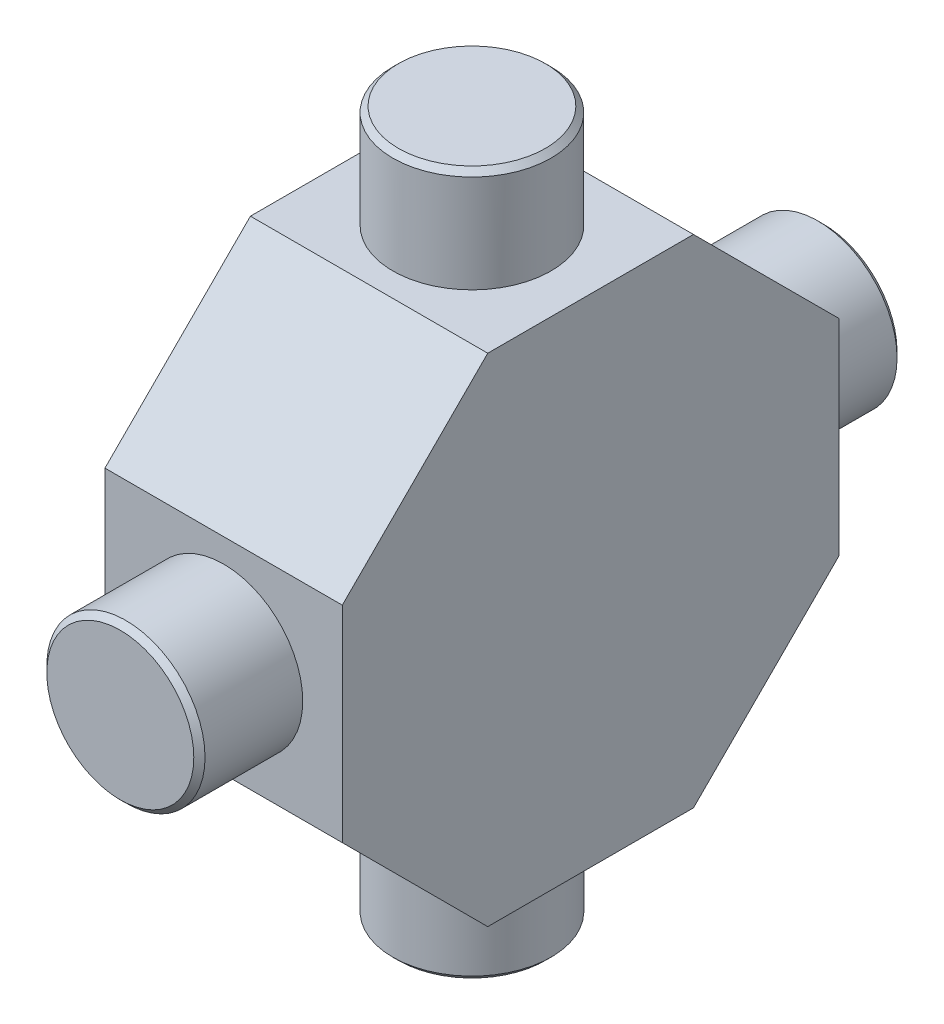
ISO-10303-21;
HEADER;
FILE_DESCRIPTION(('STEP AP214'),'2;1');
FILE_NAME('part.step','',(''),(''),'','','');
FILE_SCHEMA(('AUTOMOTIVE_DESIGN { 1 0 10303 214 1 1 1 1 }'));
ENDSEC;
DATA;
#1=APPLICATION_CONTEXT('core data for automotive mechanical design processes');
#2=APPLICATION_PROTOCOL_DEFINITION('international standard','automotive_design',2000,#1);
#3=PRODUCT_CONTEXT('',#1,'mechanical');
#4=PRODUCT('Part','Part','',(#3));
#5=PRODUCT_RELATED_PRODUCT_CATEGORY('part','',(#4));
#6=PRODUCT_DEFINITION_FORMATION('','',#4);
#7=PRODUCT_DEFINITION_CONTEXT('part definition',#1,'design');
#8=PRODUCT_DEFINITION('design','',#6,#7);
#9=PRODUCT_DEFINITION_SHAPE('','',#8);
#10=(LENGTH_UNIT() NAMED_UNIT(*) SI_UNIT(.MILLI.,.METRE.));
#11=(NAMED_UNIT(*) PLANE_ANGLE_UNIT() SI_UNIT($,.RADIAN.));
#12=(NAMED_UNIT(*) SI_UNIT($,.STERADIAN.) SOLID_ANGLE_UNIT());
#13=UNCERTAINTY_MEASURE_WITH_UNIT(LENGTH_MEASURE(1.E-05),#10,'distance_accuracy_value','');
#14=(GEOMETRIC_REPRESENTATION_CONTEXT(3) GLOBAL_UNCERTAINTY_ASSIGNED_CONTEXT((#13)) GLOBAL_UNIT_ASSIGNED_CONTEXT((#10,
#11,#12)) REPRESENTATION_CONTEXT('',''));
#15=CARTESIAN_POINT('',(0.,0.,0.));
#16=DIRECTION('',(0.,0.,1.));
#17=DIRECTION('',(1.,0.,0.));
#18=AXIS2_PLACEMENT_3D('',#15,#16,#17);
#19=CARTESIAN_POINT('',(10.715625,-22.4204995770636,9.286875));
#20=DIRECTION('',(0.,1.,0.));
#21=DIRECTION('',(0.,0.,1.));
#22=AXIS2_PLACEMENT_3D('',#19,#20,#21);
#23=PLANE('',#22);
#24=DIRECTION('',(0.,0.,-1.));
#25=VECTOR('',#24,1.);
#26=CARTESIAN_POINT('',(-10.715625,-22.4204995770636,9.286875));
#27=LINE('',#26,#25);
#28=CARTESIAN_POINT('',(-10.715625,-22.4204995770636,9.286875));
#29=VERTEX_POINT('',#28);
#30=CARTESIAN_POINT('',(-10.715625,-22.4204995770636,-9.28687499999999));
#31=VERTEX_POINT('',#30);
#32=EDGE_CURVE('E142',#29,#31,#27,.T.);
#33=ORIENTED_EDGE('',*,*,#32,.T.);
#34=DIRECTION('',(-1.,0.,0.));
#35=VECTOR('',#34,1.);
#36=CARTESIAN_POINT('',(10.715625,-22.4204995770636,-9.28687499999999));
#37=LINE('',#36,#35);
#38=CARTESIAN_POINT('',(10.715625,-22.4204995770636,-9.28687499999999));
#39=VERTEX_POINT('',#38);
#40=EDGE_CURVE('E183',#39,#31,#37,.T.);
#41=ORIENTED_EDGE('',*,*,#40,.F.);
#42=DIRECTION('',(0.,0.,-1.));
#43=VECTOR('',#42,1.);
#44=CARTESIAN_POINT('',(10.715625,-22.4204995770636,9.286875));
#45=LINE('',#44,#43);
#46=CARTESIAN_POINT('',(10.715625,-22.4204995770636,9.286875));
#47=VERTEX_POINT('',#46);
#48=EDGE_CURVE('E164',#47,#39,#45,.T.);
#49=ORIENTED_EDGE('',*,*,#48,.F.);
#50=DIRECTION('',(-1.,0.,0.));
#51=VECTOR('',#50,1.);
#52=CARTESIAN_POINT('',(10.715625,-22.4204995770636,9.286875));
#53=LINE('',#52,#51);
#54=EDGE_CURVE('E138',#47,#29,#53,.T.);
#55=ORIENTED_EDGE('',*,*,#54,.T.);
#56=EDGE_LOOP('',(#33,#41,#49,#55));
#57=FACE_BOUND('',#56,.T.);
#58=CARTESIAN_POINT('',(0.,-22.4204995770636,0.));
#59=DIRECTION('',(0.,1.,0.));
#60=DIRECTION('',(0.,0.,1.));
#61=AXIS2_PLACEMENT_3D('',#58,#59,#60);
#62=CIRCLE('',#61,7.14375);
#63=CARTESIAN_POINT('',(0.,-22.4204995770636,7.14375));
#64=VERTEX_POINT('',#63);
#65=EDGE_CURVE('E198',#64,#64,#62,.F.);
#66=ORIENTED_EDGE('',*,*,#65,.F.);
#67=EDGE_LOOP('',(#66));
#68=FACE_BOUND('',#67,.T.);
#69=ADVANCED_FACE('F39',(#57,#68),#23,.F.);
#70=CARTESIAN_POINT('',(10.715625,22.4204995770636,-9.28687500000001));
#71=DIRECTION('',(0.,-1.,0.));
#72=DIRECTION('',(0.,0.,-1.));
#73=AXIS2_PLACEMENT_3D('',#70,#71,#72);
#74=PLANE('',#73);
#75=DIRECTION('',(0.,0.,1.));
#76=VECTOR('',#75,1.);
#77=CARTESIAN_POINT('',(-10.715625,22.4204995770636,-9.28687500000001));
#78=LINE('',#77,#76);
#79=CARTESIAN_POINT('',(-10.715625,22.4204995770636,-9.28687500000001));
#80=VERTEX_POINT('',#79);
#81=CARTESIAN_POINT('',(-10.715625,22.4204995770636,9.28687499999998));
#82=VERTEX_POINT('',#81);
#83=EDGE_CURVE('E155',#80,#82,#78,.T.);
#84=ORIENTED_EDGE('',*,*,#83,.T.);
#85=DIRECTION('',(-1.,0.,0.));
#86=VECTOR('',#85,1.);
#87=CARTESIAN_POINT('',(10.715625,22.4204995770636,9.28687499999998));
#88=LINE('',#87,#86);
#89=CARTESIAN_POINT('',(10.715625,22.4204995770636,9.28687499999998));
#90=VERTEX_POINT('',#89);
#91=EDGE_CURVE('E131',#90,#82,#88,.T.);
#92=ORIENTED_EDGE('',*,*,#91,.F.);
#93=DIRECTION('',(0.,0.,1.));
#94=VECTOR('',#93,1.);
#95=CARTESIAN_POINT('',(10.715625,22.4204995770636,-9.28687500000001));
#96=LINE('',#95,#94);
#97=CARTESIAN_POINT('',(10.715625,22.4204995770636,-9.28687500000001));
#98=VERTEX_POINT('',#97);
#99=EDGE_CURVE('E120',#98,#90,#96,.T.);
#100=ORIENTED_EDGE('',*,*,#99,.F.);
#101=DIRECTION('',(-1.,0.,0.));
#102=VECTOR('',#101,1.);
#103=CARTESIAN_POINT('',(10.715625,22.4204995770636,-9.28687500000001));
#104=LINE('',#103,#102);
#105=EDGE_CURVE('E171',#98,#80,#104,.T.);
#106=ORIENTED_EDGE('',*,*,#105,.T.);
#107=EDGE_LOOP('',(#84,#92,#100,#106));
#108=FACE_BOUND('',#107,.T.);
#109=CARTESIAN_POINT('',(0.,22.4204995770636,0.));
#110=DIRECTION('',(0.,-1.,0.));
#111=DIRECTION('',(0.,0.,-1.));
#112=AXIS2_PLACEMENT_3D('',#109,#110,#111);
#113=CIRCLE('',#112,7.14375);
#114=CARTESIAN_POINT('',(0.,22.4204995770636,-7.14375));
#115=VERTEX_POINT('',#114);
#116=EDGE_CURVE('E194',#115,#115,#113,.F.);
#117=ORIENTED_EDGE('',*,*,#116,.F.);
#118=EDGE_LOOP('',(#117));
#119=FACE_BOUND('',#118,.T.);
#120=ADVANCED_FACE('F239',(#108,#119),#74,.F.);
#121=CARTESIAN_POINT('',(0.,0.,-31.75));
#122=DIRECTION('',(0.,0.,1.));
#123=DIRECTION('',(1.,0.,0.));
#124=AXIS2_PLACEMENT_3D('',#121,#122,#123);
#125=CYLINDRICAL_SURFACE('',#124,7.14375);
#126=CARTESIAN_POINT('',(0.,0.,-31.242));
#127=DIRECTION('',(0.,0.,1.));
#128=DIRECTION('',(1.,0.,0.));
#129=AXIS2_PLACEMENT_3D('',#126,#127,#128);
#130=CIRCLE('',#129,7.14375);
#131=CARTESIAN_POINT('',(7.14375,0.,-31.242));
#132=VERTEX_POINT('',#131);
#133=EDGE_CURVE('E199',#132,#132,#130,.T.);
#134=ORIENTED_EDGE('',*,*,#133,.T.);
#135=EDGE_LOOP('',(#134));
#136=FACE_BOUND('',#135,.T.);
#137=CARTESIAN_POINT('',(0.,0.,-22.4204995770636));
#138=DIRECTION('',(0.,0.,1.));
#139=DIRECTION('',(1.,0.,0.));
#140=AXIS2_PLACEMENT_3D('',#137,#138,#139);
#141=CIRCLE('',#140,7.14375);
#142=CARTESIAN_POINT('',(7.14375,0.,-22.4204995770636));
#143=VERTEX_POINT('',#142);
#144=EDGE_CURVE('E190',#143,#143,#141,.F.);
#145=ORIENTED_EDGE('',*,*,#144,.T.);
#146=EDGE_LOOP('',(#145));
#147=FACE_BOUND('',#146,.T.);
#148=ADVANCED_FACE('F245',(#136,#147),#125,.T.);
#149=CARTESIAN_POINT('',(0.,0.,-31.75));
#150=DIRECTION('',(0.,0.,1.));
#151=DIRECTION('',(1.,0.,0.));
#152=AXIS2_PLACEMENT_3D('',#149,#150,#151);
#153=PLANE('',#152);
#154=CARTESIAN_POINT('',(0.,0.,-31.75));
#155=DIRECTION('',(0.,0.,1.));
#156=DIRECTION('',(1.,0.,0.));
#157=AXIS2_PLACEMENT_3D('',#154,#155,#156);
#158=CIRCLE('',#157,6.63575);
#159=CARTESIAN_POINT('',(6.63575,0.,-31.75));
#160=VERTEX_POINT('',#159);
#161=EDGE_CURVE('E203',#160,#160,#158,.F.);
#162=ORIENTED_EDGE('',*,*,#161,.T.);
#163=EDGE_LOOP('',(#162));
#164=FACE_BOUND('',#163,.T.);
#165=ADVANCED_FACE('F259',(#164),#153,.F.);
#166=CARTESIAN_POINT('',(10.715625,-22.4204995770636,-9.28687499999999));
#167=DIRECTION('',(0.,0.707106781186548,0.707106781186547));
#168=DIRECTION('',(0.,-0.707106781186547,0.707106781186548));
#169=AXIS2_PLACEMENT_3D('',#166,#167,#168);
#170=PLANE('',#169);
#171=DIRECTION('',(0.,0.707106781186547,-0.707106781186548));
#172=VECTOR('',#171,1.);
#173=CARTESIAN_POINT('',(-10.715625,-22.4204995770636,-9.28687499999999));
#174=LINE('',#173,#172);
#175=CARTESIAN_POINT('',(-10.715625,-9.28687499999999,-22.4204995770636));
#176=VERTEX_POINT('',#175);
#177=EDGE_CURVE('E146',#31,#176,#174,.T.);
#178=ORIENTED_EDGE('',*,*,#177,.T.);
#179=DIRECTION('',(-1.,0.,0.));
#180=VECTOR('',#179,1.);
#181=CARTESIAN_POINT('',(10.715625,-9.28687499999999,-22.4204995770636));
#182=LINE('',#181,#180);
#183=CARTESIAN_POINT('',(10.715625,-9.28687499999999,-22.4204995770636));
#184=VERTEX_POINT('',#183);
#185=EDGE_CURVE('E179',#184,#176,#182,.T.);
#186=ORIENTED_EDGE('',*,*,#185,.F.);
#187=DIRECTION('',(0.,0.707106781186547,-0.707106781186548));
#188=VECTOR('',#187,1.);
#189=CARTESIAN_POINT('',(10.715625,-22.4204995770636,-9.28687499999999));
#190=LINE('',#189,#188);
#191=EDGE_CURVE('E101',#39,#184,#190,.T.);
#192=ORIENTED_EDGE('',*,*,#191,.F.);
#193=ORIENTED_EDGE('',*,*,#40,.T.);
#194=EDGE_LOOP('',(#178,#186,#192,#193));
#195=FACE_BOUND('',#194,.T.);
#196=ADVANCED_FACE('F251',(#195),#170,.F.);
#197=CARTESIAN_POINT('',(10.715625,-9.28687499999999,-22.4204995770636));
#198=DIRECTION('',(0.,0.,1.));
#199=DIRECTION('',(1.,0.,0.));
#200=AXIS2_PLACEMENT_3D('',#197,#198,#199);
#201=PLANE('',#200);
#202=ORIENTED_EDGE('',*,*,#144,.F.);
#203=EDGE_LOOP('',(#202));
#204=FACE_BOUND('',#203,.T.);
#205=DIRECTION('',(0.,1.,0.));
#206=VECTOR('',#205,1.);
#207=CARTESIAN_POINT('',(-10.715625,-9.28687499999999,-22.4204995770636));
#208=LINE('',#207,#206);
#209=CARTESIAN_POINT('',(-10.715625,9.286875,-22.4204995770636));
#210=VERTEX_POINT('',#209);
#211=EDGE_CURVE('E149',#176,#210,#208,.T.);
#212=ORIENTED_EDGE('',*,*,#211,.T.);
#213=DIRECTION('',(-1.,0.,0.));
#214=VECTOR('',#213,1.);
#215=CARTESIAN_POINT('',(10.715625,9.286875,-22.4204995770636));
#216=LINE('',#215,#214);
#217=CARTESIAN_POINT('',(10.715625,9.286875,-22.4204995770636));
#218=VERTEX_POINT('',#217);
#219=EDGE_CURVE('E175',#218,#210,#216,.T.);
#220=ORIENTED_EDGE('',*,*,#219,.F.);
#221=DIRECTION('',(0.,1.,0.));
#222=VECTOR('',#221,1.);
#223=CARTESIAN_POINT('',(10.715625,-9.28687499999999,-22.4204995770636));
#224=LINE('',#223,#222);
#225=EDGE_CURVE('E329',#184,#218,#224,.T.);
#226=ORIENTED_EDGE('',*,*,#225,.F.);
#227=ORIENTED_EDGE('',*,*,#185,.T.);
#228=EDGE_LOOP('',(#212,#220,#226,#227));
#229=FACE_BOUND('',#228,.T.);
#230=ADVANCED_FACE('F308',(#204,#229),#201,.F.);
#231=CARTESIAN_POINT('',(10.715625,9.286875,-22.4204995770636));
#232=DIRECTION('',(0.,-0.707106781186547,0.707106781186548));
#233=DIRECTION('',(0.,-0.707106781186548,-0.707106781186547));
#234=AXIS2_PLACEMENT_3D('',#231,#232,#233);
#235=PLANE('',#234);
#236=DIRECTION('',(0.,0.707106781186548,0.707106781186547));
#237=VECTOR('',#236,1.);
#238=CARTESIAN_POINT('',(-10.715625,9.286875,-22.4204995770636));
#239=LINE('',#238,#237);
#240=EDGE_CURVE('E152',#210,#80,#239,.T.);
#241=ORIENTED_EDGE('',*,*,#240,.T.);
#242=ORIENTED_EDGE('',*,*,#105,.F.);
#243=DIRECTION('',(0.,0.707106781186548,0.707106781186547));
#244=VECTOR('',#243,1.);
#245=CARTESIAN_POINT('',(10.715625,9.286875,-22.4204995770636));
#246=LINE('',#245,#244);
#247=EDGE_CURVE('E323',#218,#98,#246,.T.);
#248=ORIENTED_EDGE('',*,*,#247,.F.);
#249=ORIENTED_EDGE('',*,*,#219,.T.);
#250=EDGE_LOOP('',(#241,#242,#248,#249));
#251=FACE_BOUND('',#250,.T.);
#252=ADVANCED_FACE('F305',(#251),#235,.F.);
#253=CARTESIAN_POINT('',(10.715625,22.4204995770636,9.28687499999998));
#254=DIRECTION('',(0.,-0.707106781186548,-0.707106781186547));
#255=DIRECTION('',(0.,0.707106781186547,-0.707106781186548));
#256=AXIS2_PLACEMENT_3D('',#253,#254,#255);
#257=PLANE('',#256);
#258=DIRECTION('',(0.,-0.707106781186547,0.707106781186548));
#259=VECTOR('',#258,1.);
#260=CARTESIAN_POINT('',(-10.715625,22.4204995770636,9.28687499999998));
#261=LINE('',#260,#259);
#262=CARTESIAN_POINT('',(-10.715625,9.28687500000001,22.4204995770636));
#263=VERTEX_POINT('',#262);
#264=EDGE_CURVE('E129',#82,#263,#261,.T.);
#265=ORIENTED_EDGE('',*,*,#264,.T.);
#266=DIRECTION('',(-1.,0.,0.));
#267=VECTOR('',#266,1.);
#268=CARTESIAN_POINT('',(10.715625,9.28687500000001,22.4204995770636));
#269=LINE('',#268,#267);
#270=CARTESIAN_POINT('',(10.715625,9.28687500000001,22.4204995770636));
#271=VERTEX_POINT('',#270);
#272=EDGE_CURVE('E126',#271,#263,#269,.T.);
#273=ORIENTED_EDGE('',*,*,#272,.F.);
#274=DIRECTION('',(0.,-0.707106781186547,0.707106781186548));
#275=VECTOR('',#274,1.);
#276=CARTESIAN_POINT('',(10.715625,22.4204995770636,9.28687499999998));
#277=LINE('',#276,#275);
#278=EDGE_CURVE('E114',#90,#271,#277,.T.);
#279=ORIENTED_EDGE('',*,*,#278,.F.);
#280=ORIENTED_EDGE('',*,*,#91,.T.);
#281=EDGE_LOOP('',(#265,#273,#279,#280));
#282=FACE_BOUND('',#281,.T.);
#283=ADVANCED_FACE('F127',(#282),#257,.F.);
#284=CARTESIAN_POINT('',(10.715625,9.28687500000001,22.4204995770636));
#285=DIRECTION('',(0.,0.,-1.));
#286=DIRECTION('',(0.,1.,0.));
#287=AXIS2_PLACEMENT_3D('',#284,#285,#286);
#288=PLANE('',#287);
#289=CARTESIAN_POINT('',(0.,0.,22.4204995770636));
#290=DIRECTION('',(0.,0.,-1.));
#291=DIRECTION('',(0.,1.,0.));
#292=AXIS2_PLACEMENT_3D('',#289,#290,#291);
#293=CIRCLE('',#292,7.14375);
#294=CARTESIAN_POINT('',(0.,7.14375,22.4204995770636));
#295=VERTEX_POINT('',#294);
#296=EDGE_CURVE('E186',#295,#295,#293,.F.);
#297=ORIENTED_EDGE('',*,*,#296,.F.);
#298=EDGE_LOOP('',(#297));
#299=FACE_BOUND('',#298,.T.);
#300=DIRECTION('',(0.,-1.,0.));
#301=VECTOR('',#300,1.);
#302=CARTESIAN_POINT('',(-10.715625,9.28687500000001,22.4204995770636));
#303=LINE('',#302,#301);
#304=CARTESIAN_POINT('',(-10.715625,-9.28687499999999,22.4204995770636));
#305=VERTEX_POINT('',#304);
#306=EDGE_CURVE('E86',#263,#305,#303,.T.);
#307=ORIENTED_EDGE('',*,*,#306,.T.);
#308=DIRECTION('',(-1.,0.,0.));
#309=VECTOR('',#308,1.);
#310=CARTESIAN_POINT('',(10.715625,-9.28687499999999,22.4204995770636));
#311=LINE('',#310,#309);
#312=CARTESIAN_POINT('',(10.715625,-9.28687499999999,22.4204995770636));
#313=VERTEX_POINT('',#312);
#314=EDGE_CURVE('E132',#313,#305,#311,.T.);
#315=ORIENTED_EDGE('',*,*,#314,.F.);
#316=DIRECTION('',(0.,-1.,0.));
#317=VECTOR('',#316,1.);
#318=CARTESIAN_POINT('',(10.715625,9.28687500000001,22.4204995770636));
#319=LINE('',#318,#317);
#320=EDGE_CURVE('E118',#271,#313,#319,.T.);
#321=ORIENTED_EDGE('',*,*,#320,.F.);
#322=ORIENTED_EDGE('',*,*,#272,.T.);
#323=EDGE_LOOP('',(#307,#315,#321,#322));
#324=FACE_BOUND('',#323,.T.);
#325=ADVANCED_FACE('F134',(#299,#324),#288,.F.);
#326=CARTESIAN_POINT('',(10.715625,-9.28687499999999,22.4204995770636));
#327=DIRECTION('',(0.,0.707106781186547,-0.707106781186548));
#328=DIRECTION('',(0.,0.707106781186548,0.707106781186547));
#329=AXIS2_PLACEMENT_3D('',#326,#327,#328);
#330=PLANE('',#329);
#331=DIRECTION('',(0.,-0.707106781186548,-0.707106781186547));
#332=VECTOR('',#331,1.);
#333=CARTESIAN_POINT('',(-10.715625,-9.28687499999999,22.4204995770636));
#334=LINE('',#333,#332);
#335=EDGE_CURVE('E92',#305,#29,#334,.T.);
#336=ORIENTED_EDGE('',*,*,#335,.T.);
#337=ORIENTED_EDGE('',*,*,#54,.F.);
#338=DIRECTION('',(0.,-0.707106781186548,-0.707106781186547));
#339=VECTOR('',#338,1.);
#340=CARTESIAN_POINT('',(10.715625,-9.28687499999999,22.4204995770636));
#341=LINE('',#340,#339);
#342=EDGE_CURVE('E57',#313,#47,#341,.T.);
#343=ORIENTED_EDGE('',*,*,#342,.F.);
#344=ORIENTED_EDGE('',*,*,#314,.T.);
#345=EDGE_LOOP('',(#336,#337,#343,#344));
#346=FACE_BOUND('',#345,.T.);
#347=ADVANCED_FACE('F295',(#346),#330,.F.);
#348=CARTESIAN_POINT('',(10.715625,-22.4204995770636,-22.4204995770636));
#349=DIRECTION('',(1.,0.,0.));
#350=DIRECTION('',(0.,0.,-1.));
#351=AXIS2_PLACEMENT_3D('',#348,#349,#350);
#352=PLANE('',#351);
#353=ORIENTED_EDGE('',*,*,#48,.T.);
#354=ORIENTED_EDGE('',*,*,#191,.T.);
#355=ORIENTED_EDGE('',*,*,#225,.T.);
#356=ORIENTED_EDGE('',*,*,#247,.T.);
#357=ORIENTED_EDGE('',*,*,#99,.T.);
#358=ORIENTED_EDGE('',*,*,#278,.T.);
#359=ORIENTED_EDGE('',*,*,#320,.T.);
#360=ORIENTED_EDGE('',*,*,#342,.T.);
#361=EDGE_LOOP('',(#353,#354,#355,#356,#357,#358,#359,#360));
#362=FACE_BOUND('',#361,.T.);
#363=ADVANCED_FACE('F116',(#362),#352,.T.);
#364=CARTESIAN_POINT('',(-10.715625,-22.4204995770636,-22.4204995770636));
#365=DIRECTION('',(1.,0.,0.));
#366=DIRECTION('',(0.,0.,-1.));
#367=AXIS2_PLACEMENT_3D('',#364,#365,#366);
#368=PLANE('',#367);
#369=ORIENTED_EDGE('',*,*,#32,.F.);
#370=ORIENTED_EDGE('',*,*,#335,.F.);
#371=ORIENTED_EDGE('',*,*,#306,.F.);
#372=ORIENTED_EDGE('',*,*,#264,.F.);
#373=ORIENTED_EDGE('',*,*,#83,.F.);
#374=ORIENTED_EDGE('',*,*,#240,.F.);
#375=ORIENTED_EDGE('',*,*,#211,.F.);
#376=ORIENTED_EDGE('',*,*,#177,.F.);
#377=EDGE_LOOP('',(#369,#370,#371,#372,#373,#374,#375,#376));
#378=FACE_BOUND('',#377,.T.);
#379=ADVANCED_FACE('F257',(#378),#368,.F.);
#380=CARTESIAN_POINT('',(0.,0.,31.75));
#381=DIRECTION('',(0.,0.,1.));
#382=DIRECTION('',(1.,0.,0.));
#383=AXIS2_PLACEMENT_3D('',#380,#381,#382);
#384=PLANE('',#383);
#385=CARTESIAN_POINT('',(0.,0.,31.75));
#386=DIRECTION('',(0.,0.,1.));
#387=DIRECTION('',(1.,0.,0.));
#388=AXIS2_PLACEMENT_3D('',#385,#386,#387);
#389=CIRCLE('',#388,6.63574999999998);
#390=CARTESIAN_POINT('',(6.63574999999998,0.,31.75));
#391=VERTEX_POINT('',#390);
#392=EDGE_CURVE('E215',#391,#391,#389,.T.);
#393=ORIENTED_EDGE('',*,*,#392,.T.);
#394=EDGE_LOOP('',(#393));
#395=FACE_BOUND('',#394,.T.);
#396=ADVANCED_FACE('F253',(#395),#384,.T.);
#397=CARTESIAN_POINT('',(0.,0.,31.242));
#398=DIRECTION('',(0.,0.,1.));
#399=DIRECTION('',(1.,0.,0.));
#400=AXIS2_PLACEMENT_3D('',#397,#398,#399);
#401=CIRCLE('',#400,7.14375);
#402=CARTESIAN_POINT('',(7.14375,0.,31.242));
#403=VERTEX_POINT('',#402);
#404=EDGE_CURVE('E219',#403,#403,#401,.F.);
#405=ORIENTED_EDGE('',*,*,#404,.T.);
#406=EDGE_LOOP('',(#405));
#407=FACE_BOUND('',#406,.T.);
#408=ORIENTED_EDGE('',*,*,#296,.T.);
#409=EDGE_LOOP('',(#408));
#410=FACE_BOUND('',#409,.T.);
#411=ADVANCED_FACE('F256',(#407,#410),#125,.T.);
#412=CARTESIAN_POINT('',(0.,31.75,0.));
#413=DIRECTION('',(0.,1.,0.));
#414=DIRECTION('',(0.,0.,1.));
#415=AXIS2_PLACEMENT_3D('',#412,#413,#414);
#416=PLANE('',#415);
#417=CARTESIAN_POINT('',(0.,31.75,0.));
#418=DIRECTION('',(0.,1.,0.));
#419=DIRECTION('',(0.,0.,1.));
#420=AXIS2_PLACEMENT_3D('',#417,#418,#419);
#421=CIRCLE('',#420,6.63574999999997);
#422=CARTESIAN_POINT('',(0.,31.75,6.63574999999997));
#423=VERTEX_POINT('',#422);
#424=EDGE_CURVE('E207',#423,#423,#421,.T.);
#425=ORIENTED_EDGE('',*,*,#424,.T.);
#426=EDGE_LOOP('',(#425));
#427=FACE_BOUND('',#426,.T.);
#428=ADVANCED_FACE('F279',(#427),#416,.T.);
#429=CARTESIAN_POINT('',(0.,31.75,0.));
#430=DIRECTION('',(0.,-1.,0.));
#431=DIRECTION('',(0.,0.,-1.));
#432=AXIS2_PLACEMENT_3D('',#429,#430,#431);
#433=CYLINDRICAL_SURFACE('',#432,7.14375);
#434=CARTESIAN_POINT('',(0.,31.242,0.));
#435=DIRECTION('',(0.,1.,0.));
#436=DIRECTION('',(0.,0.,1.));
#437=AXIS2_PLACEMENT_3D('',#434,#435,#436);
#438=CIRCLE('',#437,7.14375);
#439=CARTESIAN_POINT('',(0.,31.242,7.14375));
#440=VERTEX_POINT('',#439);
#441=EDGE_CURVE('E211',#440,#440,#438,.F.);
#442=ORIENTED_EDGE('',*,*,#441,.T.);
#443=EDGE_LOOP('',(#442));
#444=FACE_BOUND('',#443,.T.);
#445=ORIENTED_EDGE('',*,*,#116,.T.);
#446=EDGE_LOOP('',(#445));
#447=FACE_BOUND('',#446,.T.);
#448=ADVANCED_FACE('F281',(#444,#447),#433,.T.);
#449=CARTESIAN_POINT('',(0.,-31.242,0.));
#450=DIRECTION('',(0.,1.,0.));
#451=DIRECTION('',(0.,0.,1.));
#452=AXIS2_PLACEMENT_3D('',#449,#450,#451);
#453=CIRCLE('',#452,7.14375);
#454=CARTESIAN_POINT('',(0.,-31.242,7.14375));
#455=VERTEX_POINT('',#454);
#456=EDGE_CURVE('E49',#455,#455,#453,.T.);
#457=ORIENTED_EDGE('',*,*,#456,.T.);
#458=EDGE_LOOP('',(#457));
#459=FACE_BOUND('',#458,.T.);
#460=ORIENTED_EDGE('',*,*,#65,.T.);
#461=EDGE_LOOP('',(#460));
#462=FACE_BOUND('',#461,.T.);
#463=ADVANCED_FACE('F226',(#459,#462),#433,.T.);
#464=CARTESIAN_POINT('',(0.,-31.75,0.));
#465=DIRECTION('',(0.,1.,0.));
#466=DIRECTION('',(0.,0.,1.));
#467=AXIS2_PLACEMENT_3D('',#464,#465,#466);
#468=PLANE('',#467);
#469=CARTESIAN_POINT('',(0.,-31.75,0.));
#470=DIRECTION('',(0.,1.,0.));
#471=DIRECTION('',(0.,0.,1.));
#472=AXIS2_PLACEMENT_3D('',#469,#470,#471);
#473=CIRCLE('',#472,6.63574999999999);
#474=CARTESIAN_POINT('',(0.,-31.75,6.63574999999999));
#475=VERTEX_POINT('',#474);
#476=EDGE_CURVE('E11',#475,#475,#473,.F.);
#477=ORIENTED_EDGE('',*,*,#476,.T.);
#478=EDGE_LOOP('',(#477));
#479=FACE_BOUND('',#478,.T.);
#480=ADVANCED_FACE('F269',(#479),#468,.F.);
#481=CARTESIAN_POINT('',(0.,0.,-31.242));
#482=DIRECTION('',(0.,0.,1.));
#483=DIRECTION('',(1.,0.,0.));
#484=AXIS2_PLACEMENT_3D('',#481,#482,#483);
#485=CONICAL_SURFACE('',#484,7.14375,0.785398163397458);
#486=ORIENTED_EDGE('',*,*,#161,.F.);
#487=EDGE_LOOP('',(#486));
#488=FACE_BOUND('',#487,.T.);
#489=ORIENTED_EDGE('',*,*,#133,.F.);
#490=EDGE_LOOP('',(#489));
#491=FACE_BOUND('',#490,.T.);
#492=ADVANCED_FACE('F266',(#488,#491),#485,.T.);
#493=CARTESIAN_POINT('',(0.,31.75,0.));
#494=DIRECTION('',(0.,-1.,0.));
#495=DIRECTION('',(0.,0.,-1.));
#496=AXIS2_PLACEMENT_3D('',#493,#494,#495);
#497=CONICAL_SURFACE('',#496,6.63574999999997,0.785398163397452);
#498=ORIENTED_EDGE('',*,*,#441,.F.);
#499=EDGE_LOOP('',(#498));
#500=FACE_BOUND('',#499,.T.);
#501=ORIENTED_EDGE('',*,*,#424,.F.);
#502=EDGE_LOOP('',(#501));
#503=FACE_BOUND('',#502,.T.);
#504=ADVANCED_FACE('F235',(#500,#503),#497,.T.);
#505=CARTESIAN_POINT('',(0.,0.,31.75));
#506=DIRECTION('',(0.,0.,-1.));
#507=DIRECTION('',(-1.,0.,0.));
#508=AXIS2_PLACEMENT_3D('',#505,#506,#507);
#509=CONICAL_SURFACE('',#508,6.63574999999998,0.785398163397458);
#510=ORIENTED_EDGE('',*,*,#404,.F.);
#511=EDGE_LOOP('',(#510));
#512=FACE_BOUND('',#511,.T.);
#513=ORIENTED_EDGE('',*,*,#392,.F.);
#514=EDGE_LOOP('',(#513));
#515=FACE_BOUND('',#514,.T.);
#516=ADVANCED_FACE('F230',(#512,#515),#509,.T.);
#517=CARTESIAN_POINT('',(0.,-31.242,0.));
#518=DIRECTION('',(0.,1.,0.));
#519=DIRECTION('',(0.,0.,1.));
#520=AXIS2_PLACEMENT_3D('',#517,#518,#519);
#521=CONICAL_SURFACE('',#520,7.14375,0.785398163397452);
#522=ORIENTED_EDGE('',*,*,#476,.F.);
#523=EDGE_LOOP('',(#522));
#524=FACE_BOUND('',#523,.T.);
#525=ORIENTED_EDGE('',*,*,#456,.F.);
#526=EDGE_LOOP('',(#525));
#527=FACE_BOUND('',#526,.T.);
#528=ADVANCED_FACE('F41',(#524,#527),#521,.T.);
#529=CLOSED_SHELL('',(#69,#120,#148,#165,#196,#230,#252,#283,#325,#347,#363,#379,#396,#411,#428,
#448,#463,#480,#492,#504,#516,#528));
#530=MANIFOLD_SOLID_BREP('B2',#529);
#531=ADVANCED_BREP_SHAPE_REPRESENTATION('',(#18,#530),#14);
#532=SHAPE_DEFINITION_REPRESENTATION(#9,#531);
ENDSEC;
END-ISO-10303-21;
